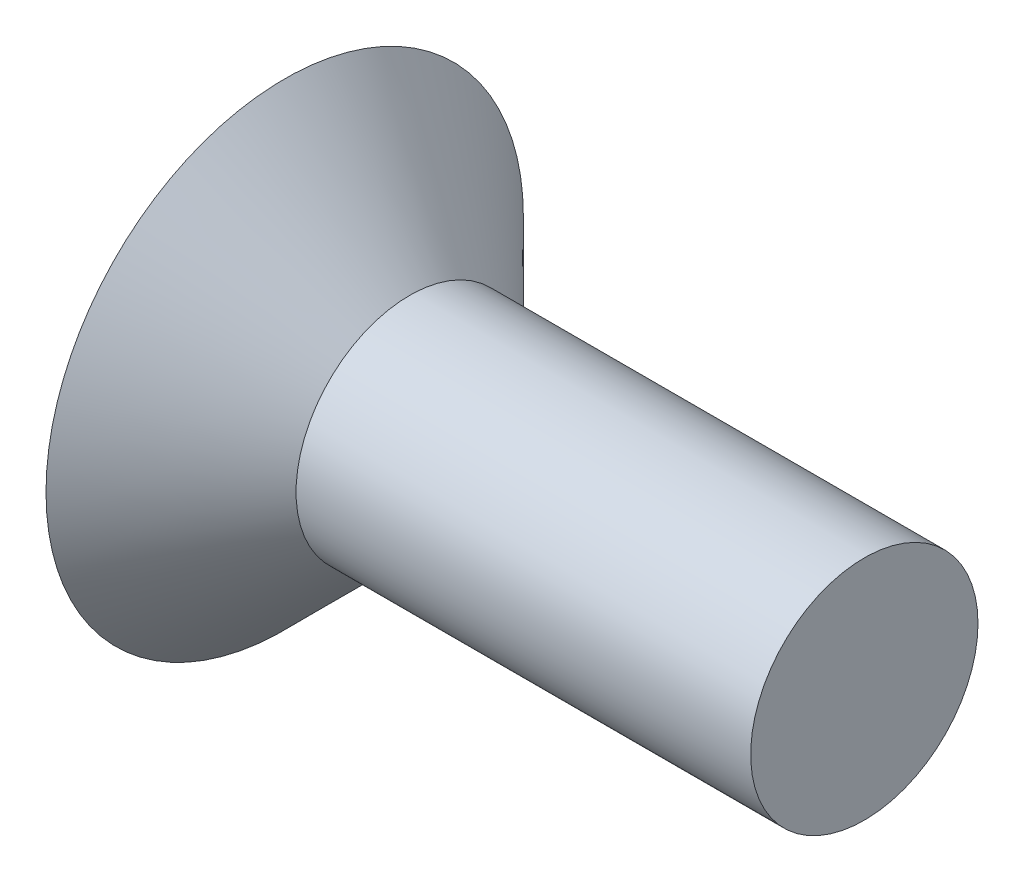
ISO-10303-21;
HEADER;
FILE_DESCRIPTION(('STEP AP214'),'2;1');
FILE_NAME('part.step','',(''),(''),'','','');
FILE_SCHEMA(('AUTOMOTIVE_DESIGN { 1 0 10303 214 1 1 1 1 }'));
ENDSEC;
DATA;
#1=APPLICATION_CONTEXT('core data for automotive mechanical design processes');
#2=APPLICATION_PROTOCOL_DEFINITION('international standard','automotive_design',2000,#1);
#3=PRODUCT_CONTEXT('',#1,'mechanical');
#4=PRODUCT('Part','Part','',(#3));
#5=PRODUCT_RELATED_PRODUCT_CATEGORY('part','',(#4));
#6=PRODUCT_DEFINITION_FORMATION('','',#4);
#7=PRODUCT_DEFINITION_CONTEXT('part definition',#1,'design');
#8=PRODUCT_DEFINITION('design','',#6,#7);
#9=PRODUCT_DEFINITION_SHAPE('','',#8);
#10=(LENGTH_UNIT() NAMED_UNIT(*) SI_UNIT(.MILLI.,.METRE.));
#11=(NAMED_UNIT(*) PLANE_ANGLE_UNIT() SI_UNIT($,.RADIAN.));
#12=(NAMED_UNIT(*) SI_UNIT($,.STERADIAN.) SOLID_ANGLE_UNIT());
#13=UNCERTAINTY_MEASURE_WITH_UNIT(LENGTH_MEASURE(1.E-05),#10,'distance_accuracy_value','');
#14=(GEOMETRIC_REPRESENTATION_CONTEXT(3) GLOBAL_UNCERTAINTY_ASSIGNED_CONTEXT((#13)) GLOBAL_UNIT_ASSIGNED_CONTEXT((#10,
#11,#12)) REPRESENTATION_CONTEXT('',''));
#15=CARTESIAN_POINT('',(0.,0.,0.));
#16=DIRECTION('',(0.,0.,1.));
#17=DIRECTION('',(1.,0.,0.));
#18=AXIS2_PLACEMENT_3D('',#15,#16,#17);
#19=CARTESIAN_POINT('',(0.,0.,0.));
#20=DIRECTION('',(-1.,0.,0.));
#21=DIRECTION('',(0.,0.,1.));
#22=AXIS2_PLACEMENT_3D('',#19,#20,#21);
#23=PLANE('',#22);
#24=CARTESIAN_POINT('',(0.,0.,0.));
#25=DIRECTION('',(1.,0.,0.));
#26=DIRECTION('',(0.,0.,-1.));
#27=AXIS2_PLACEMENT_3D('',#24,#25,#26);
#28=CIRCLE('',#27,3.14999999999996);
#29=CARTESIAN_POINT('',(0.,0.,-3.14999999999996));
#30=VERTEX_POINT('',#29);
#31=EDGE_CURVE('E10',#30,#30,#28,.T.);
#32=ORIENTED_EDGE('',*,*,#31,.F.);
#33=EDGE_LOOP('',(#32));
#34=FACE_BOUND('',#33,.T.);
#35=ADVANCED_FACE('F33',(#34),#23,.T.);
#36=CARTESIAN_POINT('',(1.65,0.,0.));
#37=DIRECTION('',(-1.,0.,0.));
#38=DIRECTION('',(0.,0.,1.));
#39=AXIS2_PLACEMENT_3D('',#36,#37,#38);
#40=CONICAL_SURFACE('',#39,1.5,0.785398163397436);
#41=ORIENTED_EDGE('',*,*,#31,.T.);
#42=EDGE_LOOP('',(#41));
#43=FACE_BOUND('',#42,.T.);
#44=CARTESIAN_POINT('',(1.65,0.,0.));
#45=DIRECTION('',(1.,0.,0.));
#46=DIRECTION('',(0.,0.,-1.));
#47=AXIS2_PLACEMENT_3D('',#44,#45,#46);
#48=CIRCLE('',#47,1.5);
#49=CARTESIAN_POINT('',(1.65,0.,-1.5));
#50=VERTEX_POINT('',#49);
#51=EDGE_CURVE('E39',#50,#50,#48,.T.);
#52=ORIENTED_EDGE('',*,*,#51,.F.);
#53=EDGE_LOOP('',(#52));
#54=FACE_BOUND('',#53,.T.);
#55=ADVANCED_FACE('F54',(#43,#54),#40,.T.);
#56=CARTESIAN_POINT('',(0.,0.,0.));
#57=DIRECTION('',(1.,0.,0.));
#58=DIRECTION('',(0.,0.,-1.));
#59=AXIS2_PLACEMENT_3D('',#56,#57,#58);
#60=CYLINDRICAL_SURFACE('',#59,1.5);
#61=ORIENTED_EDGE('',*,*,#51,.T.);
#62=EDGE_LOOP('',(#61));
#63=FACE_BOUND('',#62,.T.);
#64=CARTESIAN_POINT('',(7.65,0.,0.));
#65=DIRECTION('',(1.,0.,0.));
#66=DIRECTION('',(0.,0.,-1.));
#67=AXIS2_PLACEMENT_3D('',#64,#65,#66);
#68=CIRCLE('',#67,1.5);
#69=CARTESIAN_POINT('',(7.65,0.,-1.5));
#70=VERTEX_POINT('',#69);
#71=EDGE_CURVE('E43',#70,#70,#68,.T.);
#72=ORIENTED_EDGE('',*,*,#71,.F.);
#73=EDGE_LOOP('',(#72));
#74=FACE_BOUND('',#73,.T.);
#75=ADVANCED_FACE('F52',(#63,#74),#60,.T.);
#76=CARTESIAN_POINT('',(7.65,1.5,0.));
#77=DIRECTION('',(1.,0.,0.));
#78=DIRECTION('',(0.,0.,-1.));
#79=AXIS2_PLACEMENT_3D('',#76,#77,#78);
#80=PLANE('',#79);
#81=ORIENTED_EDGE('',*,*,#71,.T.);
#82=EDGE_LOOP('',(#81));
#83=FACE_BOUND('',#82,.T.);
#84=ADVANCED_FACE('F50',(#83),#80,.T.);
#85=CLOSED_SHELL('',(#35,#55,#75,#84));
#86=MANIFOLD_SOLID_BREP('B2',#85);
#87=ADVANCED_BREP_SHAPE_REPRESENTATION('',(#18,#86),#14);
#88=SHAPE_DEFINITION_REPRESENTATION(#9,#87);
ENDSEC;
END-ISO-10303-21;
